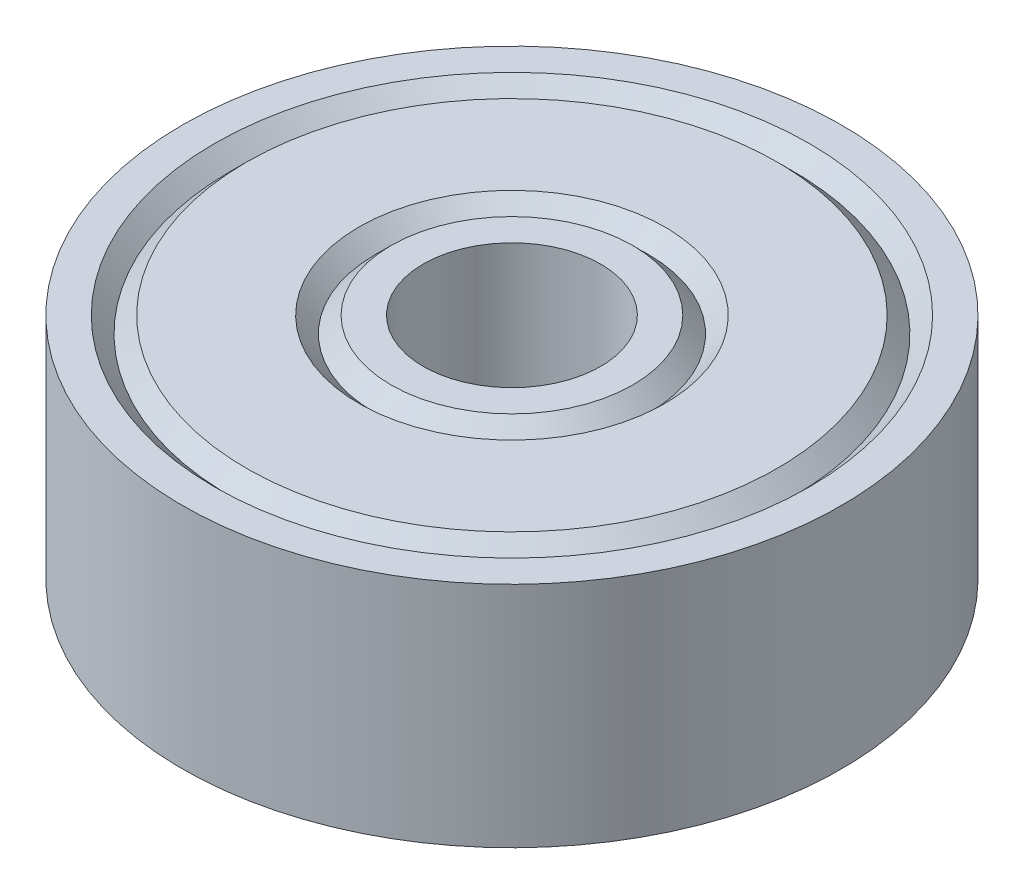
ISO-10303-21;
HEADER;
FILE_DESCRIPTION(('STEP AP214'),'2;1');
FILE_NAME('part.step','',(''),(''),'','','');
FILE_SCHEMA(('AUTOMOTIVE_DESIGN { 1 0 10303 214 1 1 1 1 }'));
ENDSEC;
DATA;
#1=APPLICATION_CONTEXT('core data for automotive mechanical design processes');
#2=APPLICATION_PROTOCOL_DEFINITION('international standard','automotive_design',2000,#1);
#3=PRODUCT_CONTEXT('',#1,'mechanical');
#4=PRODUCT('Part','Part','',(#3));
#5=PRODUCT_RELATED_PRODUCT_CATEGORY('part','',(#4));
#6=PRODUCT_DEFINITION_FORMATION('','',#4);
#7=PRODUCT_DEFINITION_CONTEXT('part definition',#1,'design');
#8=PRODUCT_DEFINITION('design','',#6,#7);
#9=PRODUCT_DEFINITION_SHAPE('','',#8);
#10=(LENGTH_UNIT() NAMED_UNIT(*) SI_UNIT(.MILLI.,.METRE.));
#11=(NAMED_UNIT(*) PLANE_ANGLE_UNIT() SI_UNIT($,.RADIAN.));
#12=(NAMED_UNIT(*) SI_UNIT($,.STERADIAN.) SOLID_ANGLE_UNIT());
#13=UNCERTAINTY_MEASURE_WITH_UNIT(LENGTH_MEASURE(1.E-05),#10,'distance_accuracy_value','');
#14=(GEOMETRIC_REPRESENTATION_CONTEXT(3) GLOBAL_UNCERTAINTY_ASSIGNED_CONTEXT((#13)) GLOBAL_UNIT_ASSIGNED_CONTEXT((#10,
#11,#12)) REPRESENTATION_CONTEXT('',''));
#15=CARTESIAN_POINT('',(0.,0.,0.));
#16=DIRECTION('',(0.,0.,1.));
#17=DIRECTION('',(1.,0.,0.));
#18=AXIS2_PLACEMENT_3D('',#15,#16,#17);
#19=CARTESIAN_POINT('',(0.,4.5,0.));
#20=DIRECTION('',(0.,1.,0.));
#21=DIRECTION('',(-1.,0.,0.));
#22=AXIS2_PLACEMENT_3D('',#19,#20,#21);
#23=CYLINDRICAL_SURFACE('',#22,3.5);
#24=CARTESIAN_POINT('',(0.,4.50000000000001,0.));
#25=DIRECTION('',(0.,1.,0.));
#26=DIRECTION('',(-1.,0.,0.));
#27=AXIS2_PLACEMENT_3D('',#24,#25,#26);
#28=CIRCLE('',#27,3.5);
#29=CARTESIAN_POINT('',(-3.5,4.50000000000001,0.));
#30=VERTEX_POINT('',#29);
#31=EDGE_CURVE('E83',#30,#30,#28,.T.);
#32=ORIENTED_EDGE('',*,*,#31,.T.);
#33=EDGE_LOOP('',(#32));
#34=FACE_BOUND('',#33,.T.);
#35=CARTESIAN_POINT('',(0.,-4.50000000000001,0.));
#36=DIRECTION('',(0.,1.,0.));
#37=DIRECTION('',(-1.,0.,0.));
#38=AXIS2_PLACEMENT_3D('',#35,#36,#37);
#39=CIRCLE('',#38,3.5);
#40=CARTESIAN_POINT('',(-3.5,-4.50000000000001,0.));
#41=VERTEX_POINT('',#40);
#42=EDGE_CURVE('E10',#41,#41,#39,.T.);
#43=ORIENTED_EDGE('',*,*,#42,.F.);
#44=EDGE_LOOP('',(#43));
#45=FACE_BOUND('',#44,.T.);
#46=ADVANCED_FACE('F31',(#34,#45),#23,.F.);
#47=CARTESIAN_POINT('',(-3.5,-4.5,0.));
#48=DIRECTION('',(0.,-1.,0.));
#49=DIRECTION('',(1.,0.,0.));
#50=AXIS2_PLACEMENT_3D('',#47,#48,#49);
#51=PLANE('',#50);
#52=ORIENTED_EDGE('',*,*,#42,.T.);
#53=EDGE_LOOP('',(#52));
#54=FACE_BOUND('',#53,.T.);
#55=CARTESIAN_POINT('',(0.,-4.5,0.));
#56=DIRECTION('',(0.,1.,0.));
#57=DIRECTION('',(-1.,0.,0.));
#58=AXIS2_PLACEMENT_3D('',#55,#56,#57);
#59=CIRCLE('',#58,4.76666666666666);
#60=CARTESIAN_POINT('',(-4.76666666666666,-4.5,0.));
#61=VERTEX_POINT('',#60);
#62=EDGE_CURVE('E37',#61,#61,#59,.T.);
#63=ORIENTED_EDGE('',*,*,#62,.F.);
#64=EDGE_LOOP('',(#63));
#65=FACE_BOUND('',#64,.T.);
#66=ADVANCED_FACE('F101',(#54,#65),#51,.T.);
#67=CARTESIAN_POINT('',(0.,-3.86666666666667,0.));
#68=DIRECTION('',(0.,1.,0.));
#69=DIRECTION('',(-1.,0.,0.));
#70=AXIS2_PLACEMENT_3D('',#67,#68,#69);
#71=CONICAL_SURFACE('',#70,5.39999999999999,0.785398163397449);
#72=ORIENTED_EDGE('',*,*,#62,.T.);
#73=EDGE_LOOP('',(#72));
#74=FACE_BOUND('',#73,.T.);
#75=CARTESIAN_POINT('',(0.,-3.86666666666667,0.));
#76=DIRECTION('',(0.,1.,0.));
#77=DIRECTION('',(-1.,0.,0.));
#78=AXIS2_PLACEMENT_3D('',#75,#76,#77);
#79=CIRCLE('',#78,5.39999999999999);
#80=CARTESIAN_POINT('',(-5.39999999999999,-3.86666666666667,0.));
#81=VERTEX_POINT('',#80);
#82=EDGE_CURVE('E41',#81,#81,#79,.T.);
#83=ORIENTED_EDGE('',*,*,#82,.F.);
#84=EDGE_LOOP('',(#83));
#85=FACE_BOUND('',#84,.T.);
#86=ADVANCED_FACE('F105',(#74,#85),#71,.T.);
#87=CARTESIAN_POINT('',(0.,-4.5,0.));
#88=DIRECTION('',(0.,-1.,0.));
#89=DIRECTION('',(1.,0.,0.));
#90=AXIS2_PLACEMENT_3D('',#87,#88,#89);
#91=CONICAL_SURFACE('',#90,6.03333333333332,0.785398163397448);
#92=ORIENTED_EDGE('',*,*,#82,.T.);
#93=EDGE_LOOP('',(#92));
#94=FACE_BOUND('',#93,.T.);
#95=CARTESIAN_POINT('',(0.,-4.5,0.));
#96=DIRECTION('',(0.,1.,0.));
#97=DIRECTION('',(-1.,0.,0.));
#98=AXIS2_PLACEMENT_3D('',#95,#96,#97);
#99=CIRCLE('',#98,6.03333333333332);
#100=CARTESIAN_POINT('',(-6.03333333333332,-4.5,0.));
#101=VERTEX_POINT('',#100);
#102=EDGE_CURVE('E45',#101,#101,#99,.T.);
#103=ORIENTED_EDGE('',*,*,#102,.F.);
#104=EDGE_LOOP('',(#103));
#105=FACE_BOUND('',#104,.T.);
#106=ADVANCED_FACE('F109',(#94,#105),#91,.F.);
#107=CARTESIAN_POINT('',(-6.03333333333332,-4.5,0.));
#108=DIRECTION('',(0.,-1.,0.));
#109=DIRECTION('',(1.,0.,0.));
#110=AXIS2_PLACEMENT_3D('',#107,#108,#109);
#111=PLANE('',#110);
#112=ORIENTED_EDGE('',*,*,#102,.T.);
#113=EDGE_LOOP('',(#112));
#114=FACE_BOUND('',#113,.T.);
#115=CARTESIAN_POINT('',(0.,-4.5,0.));
#116=DIRECTION('',(0.,1.,0.));
#117=DIRECTION('',(-1.,0.,0.));
#118=AXIS2_PLACEMENT_3D('',#115,#116,#117);
#119=CIRCLE('',#118,10.4666666666667);
#120=CARTESIAN_POINT('',(-10.4666666666667,-4.5,0.));
#121=VERTEX_POINT('',#120);
#122=EDGE_CURVE('E50',#121,#121,#119,.T.);
#123=ORIENTED_EDGE('',*,*,#122,.F.);
#124=EDGE_LOOP('',(#123));
#125=FACE_BOUND('',#124,.T.);
#126=ADVANCED_FACE('F115',(#114,#125),#111,.T.);
#127=CARTESIAN_POINT('',(0.,-3.86666666666667,0.));
#128=DIRECTION('',(0.,1.,0.));
#129=DIRECTION('',(-1.,0.,0.));
#130=AXIS2_PLACEMENT_3D('',#127,#128,#129);
#131=CONICAL_SURFACE('',#130,11.1,0.785398163397447);
#132=ORIENTED_EDGE('',*,*,#122,.T.);
#133=EDGE_LOOP('',(#132));
#134=FACE_BOUND('',#133,.T.);
#135=CARTESIAN_POINT('',(0.,-3.86666666666667,0.));
#136=DIRECTION('',(0.,1.,0.));
#137=DIRECTION('',(-1.,0.,0.));
#138=AXIS2_PLACEMENT_3D('',#135,#136,#137);
#139=CIRCLE('',#138,11.1);
#140=CARTESIAN_POINT('',(-11.1,-3.86666666666667,0.));
#141=VERTEX_POINT('',#140);
#142=EDGE_CURVE('E53',#141,#141,#139,.T.);
#143=ORIENTED_EDGE('',*,*,#142,.F.);
#144=EDGE_LOOP('',(#143));
#145=FACE_BOUND('',#144,.T.);
#146=ADVANCED_FACE('F119',(#134,#145),#131,.T.);
#147=CARTESIAN_POINT('',(0.,-4.5,0.));
#148=DIRECTION('',(0.,-1.,0.));
#149=DIRECTION('',(1.,0.,0.));
#150=AXIS2_PLACEMENT_3D('',#147,#148,#149);
#151=CONICAL_SURFACE('',#150,11.7333333333333,0.785398163397448);
#152=ORIENTED_EDGE('',*,*,#142,.T.);
#153=EDGE_LOOP('',(#152));
#154=FACE_BOUND('',#153,.T.);
#155=CARTESIAN_POINT('',(0.,-4.5,0.));
#156=DIRECTION('',(0.,1.,0.));
#157=DIRECTION('',(-1.,0.,0.));
#158=AXIS2_PLACEMENT_3D('',#155,#156,#157);
#159=CIRCLE('',#158,11.7333333333333);
#160=CARTESIAN_POINT('',(-11.7333333333333,-4.5,0.));
#161=VERTEX_POINT('',#160);
#162=EDGE_CURVE('E56',#161,#161,#159,.T.);
#163=ORIENTED_EDGE('',*,*,#162,.F.);
#164=EDGE_LOOP('',(#163));
#165=FACE_BOUND('',#164,.T.);
#166=ADVANCED_FACE('F123',(#154,#165),#151,.F.);
#167=CARTESIAN_POINT('',(-11.7333333333333,-4.5,0.));
#168=DIRECTION('',(0.,-1.,0.));
#169=DIRECTION('',(1.,0.,0.));
#170=AXIS2_PLACEMENT_3D('',#167,#168,#169);
#171=PLANE('',#170);
#172=ORIENTED_EDGE('',*,*,#162,.T.);
#173=EDGE_LOOP('',(#172));
#174=FACE_BOUND('',#173,.T.);
#175=CARTESIAN_POINT('',(0.,-4.5,0.));
#176=DIRECTION('',(0.,1.,0.));
#177=DIRECTION('',(-1.,0.,0.));
#178=AXIS2_PLACEMENT_3D('',#175,#176,#177);
#179=CIRCLE('',#178,13.);
#180=CARTESIAN_POINT('',(-13.,-4.5,0.));
#181=VERTEX_POINT('',#180);
#182=EDGE_CURVE('E59',#181,#181,#179,.T.);
#183=ORIENTED_EDGE('',*,*,#182,.F.);
#184=EDGE_LOOP('',(#183));
#185=FACE_BOUND('',#184,.T.);
#186=ADVANCED_FACE('F127',(#174,#185),#171,.T.);
#187=CARTESIAN_POINT('',(0.,4.5,0.));
#188=DIRECTION('',(0.,1.,0.));
#189=DIRECTION('',(-1.,0.,0.));
#190=AXIS2_PLACEMENT_3D('',#187,#188,#189);
#191=CYLINDRICAL_SURFACE('',#190,13.);
#192=ORIENTED_EDGE('',*,*,#182,.T.);
#193=EDGE_LOOP('',(#192));
#194=FACE_BOUND('',#193,.T.);
#195=CARTESIAN_POINT('',(0.,4.5,0.));
#196=DIRECTION('',(0.,1.,0.));
#197=DIRECTION('',(-1.,0.,0.));
#198=AXIS2_PLACEMENT_3D('',#195,#196,#197);
#199=CIRCLE('',#198,13.);
#200=CARTESIAN_POINT('',(-13.,4.5,0.));
#201=VERTEX_POINT('',#200);
#202=EDGE_CURVE('E62',#201,#201,#199,.T.);
#203=ORIENTED_EDGE('',*,*,#202,.F.);
#204=EDGE_LOOP('',(#203));
#205=FACE_BOUND('',#204,.T.);
#206=ADVANCED_FACE('F131',(#194,#205),#191,.T.);
#207=CARTESIAN_POINT('',(-11.7333333333333,4.5,0.));
#208=DIRECTION('',(0.,1.,0.));
#209=DIRECTION('',(-1.,0.,0.));
#210=AXIS2_PLACEMENT_3D('',#207,#208,#209);
#211=PLANE('',#210);
#212=ORIENTED_EDGE('',*,*,#202,.T.);
#213=EDGE_LOOP('',(#212));
#214=FACE_BOUND('',#213,.T.);
#215=CARTESIAN_POINT('',(0.,4.5,0.));
#216=DIRECTION('',(0.,1.,0.));
#217=DIRECTION('',(-1.,0.,0.));
#218=AXIS2_PLACEMENT_3D('',#215,#216,#217);
#219=CIRCLE('',#218,11.7333333333333);
#220=CARTESIAN_POINT('',(-11.7333333333333,4.5,0.));
#221=VERTEX_POINT('',#220);
#222=EDGE_CURVE('E65',#221,#221,#219,.T.);
#223=ORIENTED_EDGE('',*,*,#222,.F.);
#224=EDGE_LOOP('',(#223));
#225=FACE_BOUND('',#224,.T.);
#226=ADVANCED_FACE('F135',(#214,#225),#211,.T.);
#227=CARTESIAN_POINT('',(0.,3.86666666666667,0.));
#228=DIRECTION('',(0.,1.,0.));
#229=DIRECTION('',(-1.,0.,0.));
#230=AXIS2_PLACEMENT_3D('',#227,#228,#229);
#231=CONICAL_SURFACE('',#230,11.1,0.785398163397452);
#232=ORIENTED_EDGE('',*,*,#222,.T.);
#233=EDGE_LOOP('',(#232));
#234=FACE_BOUND('',#233,.T.);
#235=CARTESIAN_POINT('',(0.,3.86666666666667,0.));
#236=DIRECTION('',(0.,1.,0.));
#237=DIRECTION('',(-1.,0.,0.));
#238=AXIS2_PLACEMENT_3D('',#235,#236,#237);
#239=CIRCLE('',#238,11.1);
#240=CARTESIAN_POINT('',(-11.1,3.86666666666667,0.));
#241=VERTEX_POINT('',#240);
#242=EDGE_CURVE('E68',#241,#241,#239,.T.);
#243=ORIENTED_EDGE('',*,*,#242,.F.);
#244=EDGE_LOOP('',(#243));
#245=FACE_BOUND('',#244,.T.);
#246=ADVANCED_FACE('F139',(#234,#245),#231,.F.);
#247=CARTESIAN_POINT('',(0.,4.5,0.));
#248=DIRECTION('',(0.,-1.,0.));
#249=DIRECTION('',(1.,0.,0.));
#250=AXIS2_PLACEMENT_3D('',#247,#248,#249);
#251=CONICAL_SURFACE('',#250,10.4666666666667,0.785398163397444);
#252=ORIENTED_EDGE('',*,*,#242,.T.);
#253=EDGE_LOOP('',(#252));
#254=FACE_BOUND('',#253,.T.);
#255=CARTESIAN_POINT('',(0.,4.5,0.));
#256=DIRECTION('',(0.,1.,0.));
#257=DIRECTION('',(-1.,0.,0.));
#258=AXIS2_PLACEMENT_3D('',#255,#256,#257);
#259=CIRCLE('',#258,10.4666666666667);
#260=CARTESIAN_POINT('',(-10.4666666666667,4.5,0.));
#261=VERTEX_POINT('',#260);
#262=EDGE_CURVE('E71',#261,#261,#259,.T.);
#263=ORIENTED_EDGE('',*,*,#262,.F.);
#264=EDGE_LOOP('',(#263));
#265=FACE_BOUND('',#264,.T.);
#266=ADVANCED_FACE('F143',(#254,#265),#251,.T.);
#267=CARTESIAN_POINT('',(-6.03333333333332,4.5,0.));
#268=DIRECTION('',(0.,1.,0.));
#269=DIRECTION('',(-1.,0.,0.));
#270=AXIS2_PLACEMENT_3D('',#267,#268,#269);
#271=PLANE('',#270);
#272=ORIENTED_EDGE('',*,*,#262,.T.);
#273=EDGE_LOOP('',(#272));
#274=FACE_BOUND('',#273,.T.);
#275=CARTESIAN_POINT('',(0.,4.5,0.));
#276=DIRECTION('',(0.,1.,0.));
#277=DIRECTION('',(-1.,0.,0.));
#278=AXIS2_PLACEMENT_3D('',#275,#276,#277);
#279=CIRCLE('',#278,6.03333333333332);
#280=CARTESIAN_POINT('',(-6.03333333333332,4.5,0.));
#281=VERTEX_POINT('',#280);
#282=EDGE_CURVE('E74',#281,#281,#279,.T.);
#283=ORIENTED_EDGE('',*,*,#282,.F.);
#284=EDGE_LOOP('',(#283));
#285=FACE_BOUND('',#284,.T.);
#286=ADVANCED_FACE('F147',(#274,#285),#271,.T.);
#287=CARTESIAN_POINT('',(0.,3.86666666666667,0.));
#288=DIRECTION('',(0.,1.,0.));
#289=DIRECTION('',(-1.,0.,0.));
#290=AXIS2_PLACEMENT_3D('',#287,#288,#289);
#291=CONICAL_SURFACE('',#290,5.39999999999999,0.785398163397448);
#292=ORIENTED_EDGE('',*,*,#282,.T.);
#293=EDGE_LOOP('',(#292));
#294=FACE_BOUND('',#293,.T.);
#295=CARTESIAN_POINT('',(0.,3.86666666666667,0.));
#296=DIRECTION('',(0.,1.,0.));
#297=DIRECTION('',(-1.,0.,0.));
#298=AXIS2_PLACEMENT_3D('',#295,#296,#297);
#299=CIRCLE('',#298,5.39999999999999);
#300=CARTESIAN_POINT('',(-5.39999999999999,3.86666666666667,0.));
#301=VERTEX_POINT('',#300);
#302=EDGE_CURVE('E77',#301,#301,#299,.T.);
#303=ORIENTED_EDGE('',*,*,#302,.F.);
#304=EDGE_LOOP('',(#303));
#305=FACE_BOUND('',#304,.T.);
#306=ADVANCED_FACE('F97',(#294,#305),#291,.F.);
#307=CARTESIAN_POINT('',(0.,4.5,0.));
#308=DIRECTION('',(0.,-1.,0.));
#309=DIRECTION('',(1.,0.,0.));
#310=AXIS2_PLACEMENT_3D('',#307,#308,#309);
#311=CONICAL_SURFACE('',#310,4.76666666666666,0.785398163397449);
#312=ORIENTED_EDGE('',*,*,#302,.T.);
#313=EDGE_LOOP('',(#312));
#314=FACE_BOUND('',#313,.T.);
#315=CARTESIAN_POINT('',(0.,4.5,0.));
#316=DIRECTION('',(0.,1.,0.));
#317=DIRECTION('',(-1.,0.,0.));
#318=AXIS2_PLACEMENT_3D('',#315,#316,#317);
#319=CIRCLE('',#318,4.76666666666666);
#320=CARTESIAN_POINT('',(-4.76666666666666,4.5,0.));
#321=VERTEX_POINT('',#320);
#322=EDGE_CURVE('E80',#321,#321,#319,.T.);
#323=ORIENTED_EDGE('',*,*,#322,.F.);
#324=EDGE_LOOP('',(#323));
#325=FACE_BOUND('',#324,.T.);
#326=ADVANCED_FACE('F91',(#314,#325),#311,.T.);
#327=CARTESIAN_POINT('',(-3.5,4.5,0.));
#328=DIRECTION('',(0.,1.,0.));
#329=DIRECTION('',(-1.,0.,0.));
#330=AXIS2_PLACEMENT_3D('',#327,#328,#329);
#331=PLANE('',#330);
#332=ORIENTED_EDGE('',*,*,#322,.T.);
#333=EDGE_LOOP('',(#332));
#334=FACE_BOUND('',#333,.T.);
#335=ORIENTED_EDGE('',*,*,#31,.F.);
#336=EDGE_LOOP('',(#335));
#337=FACE_BOUND('',#336,.T.);
#338=ADVANCED_FACE('F89',(#334,#337),#331,.T.);
#339=CLOSED_SHELL('',(#46,#66,#86,#106,#126,#146,#166,#186,#206,#226,#246,#266,#286,#306,#326,#338));
#340=MANIFOLD_SOLID_BREP('B2',#339);
#341=ADVANCED_BREP_SHAPE_REPRESENTATION('',(#18,#340),#14);
#342=SHAPE_DEFINITION_REPRESENTATION(#9,#341);
ENDSEC;
END-ISO-10303-21;
